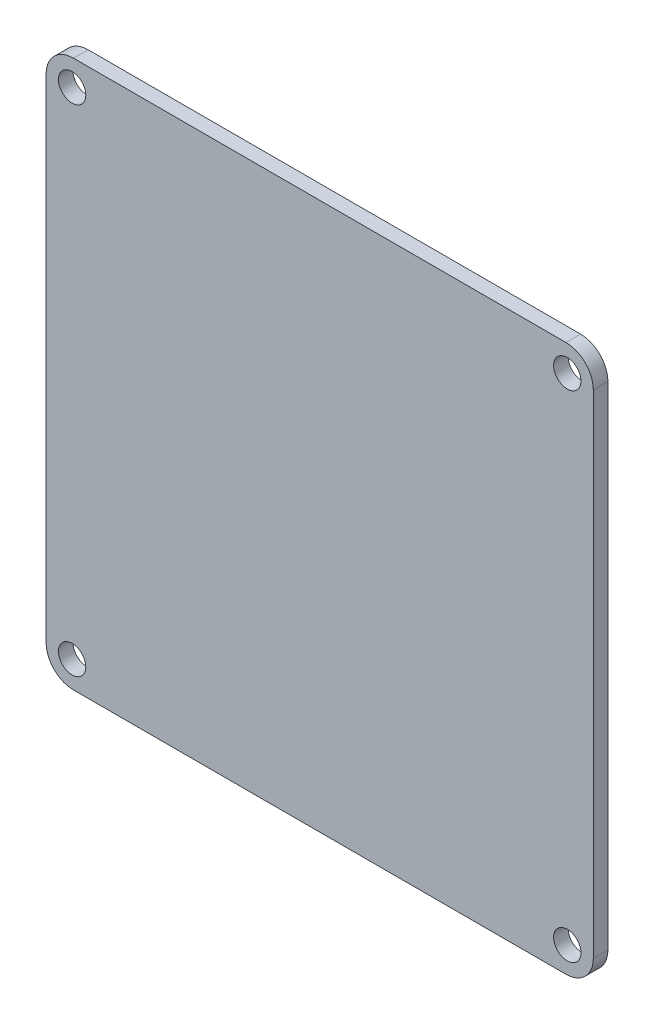
ISO-10303-21;
HEADER;
FILE_DESCRIPTION(('STEP AP214'),'2;1');
FILE_NAME('part.step','',(''),(''),'','','');
FILE_SCHEMA(('AUTOMOTIVE_DESIGN { 1 0 10303 214 1 1 1 1 }'));
ENDSEC;
DATA;
#1=APPLICATION_CONTEXT('core data for automotive mechanical design processes');
#2=APPLICATION_PROTOCOL_DEFINITION('international standard','automotive_design',2000,#1);
#3=PRODUCT_CONTEXT('',#1,'mechanical');
#4=PRODUCT('Part','Part','',(#3));
#5=PRODUCT_RELATED_PRODUCT_CATEGORY('part','',(#4));
#6=PRODUCT_DEFINITION_FORMATION('','',#4);
#7=PRODUCT_DEFINITION_CONTEXT('part definition',#1,'design');
#8=PRODUCT_DEFINITION('design','',#6,#7);
#9=PRODUCT_DEFINITION_SHAPE('','',#8);
#10=(LENGTH_UNIT() NAMED_UNIT(*) SI_UNIT(.MILLI.,.METRE.));
#11=(NAMED_UNIT(*) PLANE_ANGLE_UNIT() SI_UNIT($,.RADIAN.));
#12=(NAMED_UNIT(*) SI_UNIT($,.STERADIAN.) SOLID_ANGLE_UNIT());
#13=UNCERTAINTY_MEASURE_WITH_UNIT(LENGTH_MEASURE(1.E-05),#10,'distance_accuracy_value','');
#14=(GEOMETRIC_REPRESENTATION_CONTEXT(3) GLOBAL_UNCERTAINTY_ASSIGNED_CONTEXT((#13)) GLOBAL_UNIT_ASSIGNED_CONTEXT((#10,
#11,#12)) REPRESENTATION_CONTEXT('',''));
#15=CARTESIAN_POINT('',(0.,0.,0.));
#16=DIRECTION('',(0.,0.,1.));
#17=DIRECTION('',(1.,0.,0.));
#18=AXIS2_PLACEMENT_3D('',#15,#16,#17);
#19=CARTESIAN_POINT('',(0.,0.,1.6));
#20=DIRECTION('',(1.,0.,0.));
#21=DIRECTION('',(0.,1.,0.));
#22=AXIS2_PLACEMENT_3D('',#19,#20,#21);
#23=PLANE('',#22);
#24=DIRECTION('',(0.,-1.,0.));
#25=VECTOR('',#24,1.);
#26=CARTESIAN_POINT('',(0.,0.,0.));
#27=LINE('',#26,#25);
#28=CARTESIAN_POINT('',(0.,-3.,0.));
#29=VERTEX_POINT('',#28);
#30=CARTESIAN_POINT('',(0.,-57.,0.));
#31=VERTEX_POINT('',#30);
#32=EDGE_CURVE('E174',#29,#31,#27,.T.);
#33=ORIENTED_EDGE('',*,*,#32,.T.);
#34=DIRECTION('',(0.,0.,-1.));
#35=VECTOR('',#34,1.);
#36=CARTESIAN_POINT('',(0.,-57.,1.6));
#37=LINE('',#36,#35);
#38=CARTESIAN_POINT('',(0.,-57.,1.6));
#39=VERTEX_POINT('',#38);
#40=EDGE_CURVE('E151',#31,#39,#37,.F.);
#41=ORIENTED_EDGE('',*,*,#40,.T.);
#42=DIRECTION('',(0.,-1.,0.));
#43=VECTOR('',#42,1.);
#44=CARTESIAN_POINT('',(0.,0.,1.6));
#45=LINE('',#44,#43);
#46=CARTESIAN_POINT('',(0.,-3.,1.6));
#47=VERTEX_POINT('',#46);
#48=EDGE_CURVE('E125',#47,#39,#45,.T.);
#49=ORIENTED_EDGE('',*,*,#48,.F.);
#50=DIRECTION('',(0.,0.,-1.));
#51=VECTOR('',#50,1.);
#52=CARTESIAN_POINT('',(0.,-3.,1.6));
#53=LINE('',#52,#51);
#54=EDGE_CURVE('E138',#47,#29,#53,.T.);
#55=ORIENTED_EDGE('',*,*,#54,.T.);
#56=EDGE_LOOP('',(#33,#41,#49,#55));
#57=FACE_BOUND('',#56,.T.);
#58=ADVANCED_FACE('F38',(#57),#23,.F.);
#59=CARTESIAN_POINT('',(0.,-60.,1.6));
#60=DIRECTION('',(0.,1.,0.));
#61=DIRECTION('',(0.,0.,1.));
#62=AXIS2_PLACEMENT_3D('',#59,#60,#61);
#63=PLANE('',#62);
#64=DIRECTION('',(1.,0.,0.));
#65=VECTOR('',#64,1.);
#66=CARTESIAN_POINT('',(0.,-60.,0.));
#67=LINE('',#66,#65);
#68=CARTESIAN_POINT('',(3.00000000000001,-60.,0.));
#69=VERTEX_POINT('',#68);
#70=CARTESIAN_POINT('',(57.,-60.,0.));
#71=VERTEX_POINT('',#70);
#72=EDGE_CURVE('E131',#69,#71,#67,.T.);
#73=ORIENTED_EDGE('',*,*,#72,.T.);
#74=DIRECTION('',(0.,0.,-1.));
#75=VECTOR('',#74,1.);
#76=CARTESIAN_POINT('',(57.,-60.,1.6));
#77=LINE('',#76,#75);
#78=CARTESIAN_POINT('',(57.,-60.,1.6));
#79=VERTEX_POINT('',#78);
#80=EDGE_CURVE('E46',#71,#79,#77,.F.);
#81=ORIENTED_EDGE('',*,*,#80,.T.);
#82=DIRECTION('',(1.,0.,0.));
#83=VECTOR('',#82,1.);
#84=CARTESIAN_POINT('',(0.,-60.,1.6));
#85=LINE('',#84,#83);
#86=CARTESIAN_POINT('',(3.00000000000001,-60.,1.6));
#87=VERTEX_POINT('',#86);
#88=EDGE_CURVE('E129',#87,#79,#85,.T.);
#89=ORIENTED_EDGE('',*,*,#88,.F.);
#90=DIRECTION('',(0.,0.,-1.));
#91=VECTOR('',#90,1.);
#92=CARTESIAN_POINT('',(3.00000000000001,-60.,1.6));
#93=LINE('',#92,#91);
#94=EDGE_CURVE('E146',#87,#69,#93,.T.);
#95=ORIENTED_EDGE('',*,*,#94,.T.);
#96=EDGE_LOOP('',(#73,#81,#89,#95));
#97=FACE_BOUND('',#96,.T.);
#98=ADVANCED_FACE('F177',(#97),#63,.F.);
#99=CARTESIAN_POINT('',(60.,0.,1.6));
#100=DIRECTION('',(-1.,0.,0.));
#101=DIRECTION('',(0.,0.,1.));
#102=AXIS2_PLACEMENT_3D('',#99,#100,#101);
#103=PLANE('',#102);
#104=DIRECTION('',(0.,1.,0.));
#105=VECTOR('',#104,1.);
#106=CARTESIAN_POINT('',(60.,0.,1.6));
#107=LINE('',#106,#105);
#108=CARTESIAN_POINT('',(60.,-57.,1.6));
#109=VERTEX_POINT('',#108);
#110=CARTESIAN_POINT('',(60.,-3.,1.6));
#111=VERTEX_POINT('',#110);
#112=EDGE_CURVE('E162',#109,#111,#107,.T.);
#113=ORIENTED_EDGE('',*,*,#112,.F.);
#114=DIRECTION('',(0.,0.,-1.));
#115=VECTOR('',#114,1.);
#116=CARTESIAN_POINT('',(60.,-57.,1.6));
#117=LINE('',#116,#115);
#118=CARTESIAN_POINT('',(60.,-57.,0.));
#119=VERTEX_POINT('',#118);
#120=EDGE_CURVE('E155',#109,#119,#117,.T.);
#121=ORIENTED_EDGE('',*,*,#120,.T.);
#122=DIRECTION('',(0.,1.,0.));
#123=VECTOR('',#122,1.);
#124=CARTESIAN_POINT('',(60.,0.,0.));
#125=LINE('',#124,#123);
#126=CARTESIAN_POINT('',(60.,-3.,0.));
#127=VERTEX_POINT('',#126);
#128=EDGE_CURVE('E126',#119,#127,#125,.T.);
#129=ORIENTED_EDGE('',*,*,#128,.T.);
#130=DIRECTION('',(0.,0.,-1.));
#131=VECTOR('',#130,1.);
#132=CARTESIAN_POINT('',(60.,-3.,1.6));
#133=LINE('',#132,#131);
#134=EDGE_CURVE('E110',#127,#111,#133,.F.);
#135=ORIENTED_EDGE('',*,*,#134,.T.);
#136=EDGE_LOOP('',(#113,#121,#129,#135));
#137=FACE_BOUND('',#136,.T.);
#138=ADVANCED_FACE('F161',(#137),#103,.F.);
#139=CARTESIAN_POINT('',(0.,0.,1.6));
#140=DIRECTION('',(0.,-1.,0.));
#141=DIRECTION('',(0.,0.,-1.));
#142=AXIS2_PLACEMENT_3D('',#139,#140,#141);
#143=PLANE('',#142);
#144=DIRECTION('',(-1.,0.,0.));
#145=VECTOR('',#144,1.);
#146=CARTESIAN_POINT('',(0.,0.,0.));
#147=LINE('',#146,#145);
#148=CARTESIAN_POINT('',(57.,0.,0.));
#149=VERTEX_POINT('',#148);
#150=CARTESIAN_POINT('',(3.,0.,0.));
#151=VERTEX_POINT('',#150);
#152=EDGE_CURVE('E117',#149,#151,#147,.T.);
#153=ORIENTED_EDGE('',*,*,#152,.T.);
#154=DIRECTION('',(0.,0.,-1.));
#155=VECTOR('',#154,1.);
#156=CARTESIAN_POINT('',(3.,0.,1.6));
#157=LINE('',#156,#155);
#158=CARTESIAN_POINT('',(3.,0.,1.6));
#159=VERTEX_POINT('',#158);
#160=EDGE_CURVE('E142',#151,#159,#157,.F.);
#161=ORIENTED_EDGE('',*,*,#160,.T.);
#162=DIRECTION('',(-1.,0.,0.));
#163=VECTOR('',#162,1.);
#164=CARTESIAN_POINT('',(0.,0.,1.6));
#165=LINE('',#164,#163);
#166=CARTESIAN_POINT('',(57.,0.,1.6));
#167=VERTEX_POINT('',#166);
#168=EDGE_CURVE('E120',#167,#159,#165,.T.);
#169=ORIENTED_EDGE('',*,*,#168,.F.);
#170=DIRECTION('',(0.,0.,-1.));
#171=VECTOR('',#170,1.);
#172=CARTESIAN_POINT('',(57.,0.,1.6));
#173=LINE('',#172,#171);
#174=EDGE_CURVE('E108',#167,#149,#173,.T.);
#175=ORIENTED_EDGE('',*,*,#174,.T.);
#176=EDGE_LOOP('',(#153,#161,#169,#175));
#177=FACE_BOUND('',#176,.T.);
#178=ADVANCED_FACE('F116',(#177),#143,.F.);
#179=CARTESIAN_POINT('',(0.,0.,1.6));
#180=DIRECTION('',(0.,0.,1.));
#181=DIRECTION('',(1.,0.,0.));
#182=AXIS2_PLACEMENT_3D('',#179,#180,#181);
#183=PLANE('',#182);
#184=CARTESIAN_POINT('',(57.15,-57.15,1.6));
#185=DIRECTION('',(0.,0.,1.));
#186=DIRECTION('',(1.,0.,0.));
#187=AXIS2_PLACEMENT_3D('',#184,#185,#186);
#188=CIRCLE('',#187,1.5);
#189=CARTESIAN_POINT('',(58.65,-57.15,1.6));
#190=VERTEX_POINT('',#189);
#191=EDGE_CURVE('E176',#190,#190,#188,.T.);
#192=ORIENTED_EDGE('',*,*,#191,.F.);
#193=EDGE_LOOP('',(#192));
#194=FACE_BOUND('',#193,.T.);
#195=CARTESIAN_POINT('',(2.85000000000001,-57.15,1.6));
#196=DIRECTION('',(0.,0.,1.));
#197=DIRECTION('',(1.,0.,0.));
#198=AXIS2_PLACEMENT_3D('',#195,#196,#197);
#199=CIRCLE('',#198,1.5);
#200=CARTESIAN_POINT('',(4.35000000000001,-57.15,1.6));
#201=VERTEX_POINT('',#200);
#202=EDGE_CURVE('E331',#201,#201,#199,.T.);
#203=ORIENTED_EDGE('',*,*,#202,.F.);
#204=EDGE_LOOP('',(#203));
#205=FACE_BOUND('',#204,.T.);
#206=CARTESIAN_POINT('',(2.85000000000001,-2.85000000000001,1.6));
#207=DIRECTION('',(0.,0.,1.));
#208=DIRECTION('',(1.,0.,0.));
#209=AXIS2_PLACEMENT_3D('',#206,#207,#208);
#210=CIRCLE('',#209,1.5);
#211=CARTESIAN_POINT('',(4.35,-2.85000000000001,1.6));
#212=VERTEX_POINT('',#211);
#213=EDGE_CURVE('E311',#212,#212,#210,.T.);
#214=ORIENTED_EDGE('',*,*,#213,.F.);
#215=EDGE_LOOP('',(#214));
#216=FACE_BOUND('',#215,.T.);
#217=CARTESIAN_POINT('',(57.15,-2.85000000000001,1.6));
#218=DIRECTION('',(0.,0.,1.));
#219=DIRECTION('',(1.,0.,0.));
#220=AXIS2_PLACEMENT_3D('',#217,#218,#219);
#221=CIRCLE('',#220,1.5);
#222=CARTESIAN_POINT('',(58.65,-2.85000000000001,1.6));
#223=VERTEX_POINT('',#222);
#224=EDGE_CURVE('E320',#223,#223,#221,.T.);
#225=ORIENTED_EDGE('',*,*,#224,.F.);
#226=EDGE_LOOP('',(#225));
#227=FACE_BOUND('',#226,.T.);
#228=ORIENTED_EDGE('',*,*,#88,.T.);
#229=CARTESIAN_POINT('',(57.,-57.,1.6));
#230=DIRECTION('',(0.,0.,1.));
#231=DIRECTION('',(1.,0.,0.));
#232=AXIS2_PLACEMENT_3D('',#229,#230,#231);
#233=CIRCLE('',#232,3.);
#234=EDGE_CURVE('E11',#79,#109,#233,.T.);
#235=ORIENTED_EDGE('',*,*,#234,.T.);
#236=ORIENTED_EDGE('',*,*,#112,.T.);
#237=CARTESIAN_POINT('',(57.,-3.,1.6));
#238=DIRECTION('',(0.,0.,1.));
#239=DIRECTION('',(1.,0.,0.));
#240=AXIS2_PLACEMENT_3D('',#237,#238,#239);
#241=CIRCLE('',#240,3.);
#242=EDGE_CURVE('E136',#111,#167,#241,.T.);
#243=ORIENTED_EDGE('',*,*,#242,.T.);
#244=ORIENTED_EDGE('',*,*,#168,.T.);
#245=CARTESIAN_POINT('',(3.,-3.,1.6));
#246=DIRECTION('',(0.,0.,1.));
#247=DIRECTION('',(1.,0.,0.));
#248=AXIS2_PLACEMENT_3D('',#245,#246,#247);
#249=CIRCLE('',#248,3.);
#250=EDGE_CURVE('E144',#159,#47,#249,.T.);
#251=ORIENTED_EDGE('',*,*,#250,.T.);
#252=ORIENTED_EDGE('',*,*,#48,.T.);
#253=CARTESIAN_POINT('',(3.00000000000001,-57.,1.6));
#254=DIRECTION('',(0.,0.,1.));
#255=DIRECTION('',(1.,0.,0.));
#256=AXIS2_PLACEMENT_3D('',#253,#254,#255);
#257=CIRCLE('',#256,3.);
#258=EDGE_CURVE('E153',#39,#87,#257,.T.);
#259=ORIENTED_EDGE('',*,*,#258,.T.);
#260=EDGE_LOOP('',(#228,#235,#236,#243,#244,#251,#252,#259));
#261=FACE_BOUND('',#260,.T.);
#262=ADVANCED_FACE('F166',(#194,#205,#216,#227,#261),#183,.T.);
#263=CARTESIAN_POINT('',(0.,0.,0.));
#264=DIRECTION('',(0.,0.,1.));
#265=DIRECTION('',(1.,0.,0.));
#266=AXIS2_PLACEMENT_3D('',#263,#264,#265);
#267=PLANE('',#266);
#268=CARTESIAN_POINT('',(57.15,-57.15,0.));
#269=DIRECTION('',(0.,0.,-1.));
#270=DIRECTION('',(-1.,0.,0.));
#271=AXIS2_PLACEMENT_3D('',#268,#269,#270);
#272=CIRCLE('',#271,1.5);
#273=CARTESIAN_POINT('',(55.65,-57.15,0.));
#274=VERTEX_POINT('',#273);
#275=EDGE_CURVE('E323',#274,#274,#272,.T.);
#276=ORIENTED_EDGE('',*,*,#275,.F.);
#277=EDGE_LOOP('',(#276));
#278=FACE_BOUND('',#277,.T.);
#279=CARTESIAN_POINT('',(2.85000000000001,-57.15,0.));
#280=DIRECTION('',(0.,0.,-1.));
#281=DIRECTION('',(-1.,0.,0.));
#282=AXIS2_PLACEMENT_3D('',#279,#280,#281);
#283=CIRCLE('',#282,1.5);
#284=CARTESIAN_POINT('',(1.35,-57.15,0.));
#285=VERTEX_POINT('',#284);
#286=EDGE_CURVE('E317',#285,#285,#283,.T.);
#287=ORIENTED_EDGE('',*,*,#286,.F.);
#288=EDGE_LOOP('',(#287));
#289=FACE_BOUND('',#288,.T.);
#290=CARTESIAN_POINT('',(2.85000000000001,-2.85000000000001,0.));
#291=DIRECTION('',(0.,0.,-1.));
#292=DIRECTION('',(-1.,0.,0.));
#293=AXIS2_PLACEMENT_3D('',#290,#291,#292);
#294=CIRCLE('',#293,1.5);
#295=CARTESIAN_POINT('',(1.35000000000001,-2.85000000000001,0.));
#296=VERTEX_POINT('',#295);
#297=EDGE_CURVE('E314',#296,#296,#294,.T.);
#298=ORIENTED_EDGE('',*,*,#297,.F.);
#299=EDGE_LOOP('',(#298));
#300=FACE_BOUND('',#299,.T.);
#301=CARTESIAN_POINT('',(57.15,-2.85000000000001,0.));
#302=DIRECTION('',(0.,0.,-1.));
#303=DIRECTION('',(-1.,0.,0.));
#304=AXIS2_PLACEMENT_3D('',#301,#302,#303);
#305=CIRCLE('',#304,1.5);
#306=CARTESIAN_POINT('',(55.65,-2.85000000000001,0.));
#307=VERTEX_POINT('',#306);
#308=EDGE_CURVE('E316',#307,#307,#305,.T.);
#309=ORIENTED_EDGE('',*,*,#308,.F.);
#310=EDGE_LOOP('',(#309));
#311=FACE_BOUND('',#310,.T.);
#312=ORIENTED_EDGE('',*,*,#128,.F.);
#313=CARTESIAN_POINT('',(57.,-57.,0.));
#314=DIRECTION('',(0.,0.,1.));
#315=DIRECTION('',(1.,0.,0.));
#316=AXIS2_PLACEMENT_3D('',#313,#314,#315);
#317=CIRCLE('',#316,3.);
#318=EDGE_CURVE('E60',#119,#71,#317,.F.);
#319=ORIENTED_EDGE('',*,*,#318,.T.);
#320=ORIENTED_EDGE('',*,*,#72,.F.);
#321=CARTESIAN_POINT('',(3.00000000000001,-57.,0.));
#322=DIRECTION('',(0.,0.,1.));
#323=DIRECTION('',(1.,0.,0.));
#324=AXIS2_PLACEMENT_3D('',#321,#322,#323);
#325=CIRCLE('',#324,3.);
#326=EDGE_CURVE('E149',#69,#31,#325,.F.);
#327=ORIENTED_EDGE('',*,*,#326,.T.);
#328=ORIENTED_EDGE('',*,*,#32,.F.);
#329=CARTESIAN_POINT('',(3.,-3.,0.));
#330=DIRECTION('',(0.,0.,1.));
#331=DIRECTION('',(1.,0.,0.));
#332=AXIS2_PLACEMENT_3D('',#329,#330,#331);
#333=CIRCLE('',#332,3.);
#334=EDGE_CURVE('E124',#29,#151,#333,.F.);
#335=ORIENTED_EDGE('',*,*,#334,.T.);
#336=ORIENTED_EDGE('',*,*,#152,.F.);
#337=CARTESIAN_POINT('',(57.,-3.,0.));
#338=DIRECTION('',(0.,0.,1.));
#339=DIRECTION('',(1.,0.,0.));
#340=AXIS2_PLACEMENT_3D('',#337,#338,#339);
#341=CIRCLE('',#340,3.);
#342=EDGE_CURVE('E104',#149,#127,#341,.F.);
#343=ORIENTED_EDGE('',*,*,#342,.T.);
#344=EDGE_LOOP('',(#312,#319,#320,#327,#328,#335,#336,#343));
#345=FACE_BOUND('',#344,.T.);
#346=ADVANCED_FACE('F122',(#278,#289,#300,#311,#345),#267,.F.);
#347=CARTESIAN_POINT('',(57.15,-2.85000000000001,19.6));
#348=DIRECTION('',(0.,0.,-1.));
#349=DIRECTION('',(-1.,0.,0.));
#350=AXIS2_PLACEMENT_3D('',#347,#348,#349);
#351=CYLINDRICAL_SURFACE('',#350,1.5);
#352=ORIENTED_EDGE('',*,*,#224,.T.);
#353=EDGE_LOOP('',(#352));
#354=FACE_BOUND('',#353,.T.);
#355=ORIENTED_EDGE('',*,*,#308,.T.);
#356=EDGE_LOOP('',(#355));
#357=FACE_BOUND('',#356,.T.);
#358=ADVANCED_FACE('F218',(#354,#357),#351,.F.);
#359=CARTESIAN_POINT('',(2.85000000000001,-2.85000000000001,19.6));
#360=DIRECTION('',(0.,0.,-1.));
#361=DIRECTION('',(-1.,0.,0.));
#362=AXIS2_PLACEMENT_3D('',#359,#360,#361);
#363=CYLINDRICAL_SURFACE('',#362,1.5);
#364=ORIENTED_EDGE('',*,*,#213,.T.);
#365=EDGE_LOOP('',(#364));
#366=FACE_BOUND('',#365,.T.);
#367=ORIENTED_EDGE('',*,*,#297,.T.);
#368=EDGE_LOOP('',(#367));
#369=FACE_BOUND('',#368,.T.);
#370=ADVANCED_FACE('F211',(#366,#369),#363,.F.);
#371=CARTESIAN_POINT('',(2.85000000000001,-57.15,19.6));
#372=DIRECTION('',(0.,0.,-1.));
#373=DIRECTION('',(-1.,0.,0.));
#374=AXIS2_PLACEMENT_3D('',#371,#372,#373);
#375=CYLINDRICAL_SURFACE('',#374,1.5);
#376=ORIENTED_EDGE('',*,*,#202,.T.);
#377=EDGE_LOOP('',(#376));
#378=FACE_BOUND('',#377,.T.);
#379=ORIENTED_EDGE('',*,*,#286,.T.);
#380=EDGE_LOOP('',(#379));
#381=FACE_BOUND('',#380,.T.);
#382=ADVANCED_FACE('F205',(#378,#381),#375,.F.);
#383=CARTESIAN_POINT('',(57.15,-57.15,19.6));
#384=DIRECTION('',(0.,0.,-1.));
#385=DIRECTION('',(-1.,0.,0.));
#386=AXIS2_PLACEMENT_3D('',#383,#384,#385);
#387=CYLINDRICAL_SURFACE('',#386,1.5);
#388=ORIENTED_EDGE('',*,*,#191,.T.);
#389=EDGE_LOOP('',(#388));
#390=FACE_BOUND('',#389,.T.);
#391=ORIENTED_EDGE('',*,*,#275,.T.);
#392=EDGE_LOOP('',(#391));
#393=FACE_BOUND('',#392,.T.);
#394=ADVANCED_FACE('F201',(#390,#393),#387,.F.);
#395=CARTESIAN_POINT('',(57.,-3.,1.6));
#396=DIRECTION('',(0.,0.,-1.));
#397=DIRECTION('',(-1.,0.,0.));
#398=AXIS2_PLACEMENT_3D('',#395,#396,#397);
#399=CYLINDRICAL_SURFACE('',#398,3.);
#400=ORIENTED_EDGE('',*,*,#242,.F.);
#401=ORIENTED_EDGE('',*,*,#134,.F.);
#402=ORIENTED_EDGE('',*,*,#342,.F.);
#403=ORIENTED_EDGE('',*,*,#174,.F.);
#404=EDGE_LOOP('',(#400,#401,#402,#403));
#405=FACE_BOUND('',#404,.T.);
#406=ADVANCED_FACE('F107',(#405),#399,.T.);
#407=CARTESIAN_POINT('',(3.,-3.,1.6));
#408=DIRECTION('',(0.,0.,-1.));
#409=DIRECTION('',(-1.,0.,0.));
#410=AXIS2_PLACEMENT_3D('',#407,#408,#409);
#411=CYLINDRICAL_SURFACE('',#410,3.);
#412=ORIENTED_EDGE('',*,*,#250,.F.);
#413=ORIENTED_EDGE('',*,*,#160,.F.);
#414=ORIENTED_EDGE('',*,*,#334,.F.);
#415=ORIENTED_EDGE('',*,*,#54,.F.);
#416=EDGE_LOOP('',(#412,#413,#414,#415));
#417=FACE_BOUND('',#416,.T.);
#418=ADVANCED_FACE('F185',(#417),#411,.T.);
#419=CARTESIAN_POINT('',(3.00000000000001,-57.,1.6));
#420=DIRECTION('',(0.,0.,-1.));
#421=DIRECTION('',(-1.,0.,0.));
#422=AXIS2_PLACEMENT_3D('',#419,#420,#421);
#423=CYLINDRICAL_SURFACE('',#422,3.);
#424=ORIENTED_EDGE('',*,*,#258,.F.);
#425=ORIENTED_EDGE('',*,*,#40,.F.);
#426=ORIENTED_EDGE('',*,*,#326,.F.);
#427=ORIENTED_EDGE('',*,*,#94,.F.);
#428=EDGE_LOOP('',(#424,#425,#426,#427));
#429=FACE_BOUND('',#428,.T.);
#430=ADVANCED_FACE('F183',(#429),#423,.T.);
#431=CARTESIAN_POINT('',(57.,-57.,1.6));
#432=DIRECTION('',(0.,0.,-1.));
#433=DIRECTION('',(-1.,0.,0.));
#434=AXIS2_PLACEMENT_3D('',#431,#432,#433);
#435=CYLINDRICAL_SURFACE('',#434,3.);
#436=ORIENTED_EDGE('',*,*,#234,.F.);
#437=ORIENTED_EDGE('',*,*,#80,.F.);
#438=ORIENTED_EDGE('',*,*,#318,.F.);
#439=ORIENTED_EDGE('',*,*,#120,.F.);
#440=EDGE_LOOP('',(#436,#437,#438,#439));
#441=FACE_BOUND('',#440,.T.);
#442=ADVANCED_FACE('F40',(#441),#435,.T.);
#443=CLOSED_SHELL('',(#58,#98,#138,#178,#262,#346,#358,#370,#382,#394,#406,#418,#430,#442));
#444=MANIFOLD_SOLID_BREP('B2',#443);
#445=ADVANCED_BREP_SHAPE_REPRESENTATION('',(#18,#444),#14);
#446=SHAPE_DEFINITION_REPRESENTATION(#9,#445);
ENDSEC;
END-ISO-10303-21;
